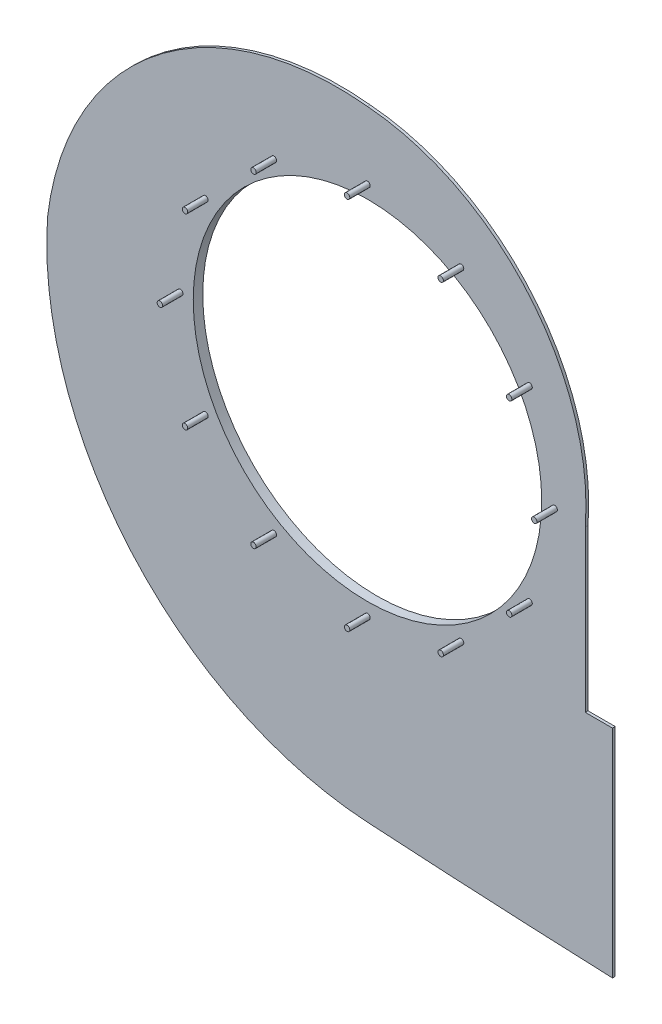
ISO-10303-21;
HEADER;
FILE_DESCRIPTION(('STEP AP214'),'2;1');
FILE_NAME('part.step','',(''),(''),'','','');
FILE_SCHEMA(('AUTOMOTIVE_DESIGN { 1 0 10303 214 1 1 1 1 }'));
ENDSEC;
DATA;
#1=APPLICATION_CONTEXT('core data for automotive mechanical design processes');
#2=APPLICATION_PROTOCOL_DEFINITION('international standard','automotive_design',2000,#1);
#3=PRODUCT_CONTEXT('',#1,'mechanical');
#4=PRODUCT('Part','Part','',(#3));
#5=PRODUCT_RELATED_PRODUCT_CATEGORY('part','',(#4));
#6=PRODUCT_DEFINITION_FORMATION('','',#4);
#7=PRODUCT_DEFINITION_CONTEXT('part definition',#1,'design');
#8=PRODUCT_DEFINITION('design','',#6,#7);
#9=PRODUCT_DEFINITION_SHAPE('','',#8);
#10=(LENGTH_UNIT() NAMED_UNIT(*) SI_UNIT(.MILLI.,.METRE.));
#11=(NAMED_UNIT(*) PLANE_ANGLE_UNIT() SI_UNIT($,.RADIAN.));
#12=(NAMED_UNIT(*) SI_UNIT($,.STERADIAN.) SOLID_ANGLE_UNIT());
#13=UNCERTAINTY_MEASURE_WITH_UNIT(LENGTH_MEASURE(1.E-05),#10,'distance_accuracy_value','');
#14=(GEOMETRIC_REPRESENTATION_CONTEXT(3) GLOBAL_UNCERTAINTY_ASSIGNED_CONTEXT((#13)) GLOBAL_UNIT_ASSIGNED_CONTEXT((#10,
#11,#12)) REPRESENTATION_CONTEXT('',''));
#15=CARTESIAN_POINT('',(0.,0.,0.));
#16=DIRECTION('',(0.,0.,1.));
#17=DIRECTION('',(1.,0.,0.));
#18=AXIS2_PLACEMENT_3D('',#15,#16,#17);
#19=CARTESIAN_POINT('',(576.066247787801,722.326123374747,0.));
#20=DIRECTION('',(0.,0.,-1.));
#21=DIRECTION('',(-1.,0.,0.));
#22=AXIS2_PLACEMENT_3D('',#19,#20,#21);
#23=PLANE('',#22);
#24=CARTESIAN_POINT('',(576.066247787801,722.326123374747,0.));
#25=DIRECTION('',(0.,0.,1.));
#26=DIRECTION('',(-1.,0.,0.));
#27=AXIS2_PLACEMENT_3D('',#24,#25,#26);
#28=CIRCLE('',#27,501.999999999996);
#29=CARTESIAN_POINT('',(75.2691276417093,757.057153497337,0.));
#30=VERTEX_POINT('',#29);
#31=CARTESIAN_POINT('',(545.269127641714,221.271697797341,0.));
#32=VERTEX_POINT('',#31);
#33=EDGE_CURVE('E133',#30,#32,#28,.T.);
#34=ORIENTED_EDGE('',*,*,#33,.F.);
#35=CARTESIAN_POINT('',(500.927222897748,705.599007443102,0.));
#36=DIRECTION('',(0.,0.,1.));
#37=DIRECTION('',(-1.,0.,0.));
#38=AXIS2_PLACEMENT_3D('',#35,#36,#37);
#39=CIRCLE('',#38,428.75722134133);
#40=CARTESIAN_POINT('',(545.269127641709,1132.05715349734,0.));
#41=VERTEX_POINT('',#40);
#42=EDGE_CURVE('E90',#41,#30,#39,.T.);
#43=ORIENTED_EDGE('',*,*,#42,.F.);
#44=CARTESIAN_POINT('',(517.354671903609,784.203484600825,0.));
#45=DIRECTION('',(0.,0.,1.));
#46=DIRECTION('',(-1.,0.,0.));
#47=AXIS2_PLACEMENT_3D('',#44,#45,#46);
#48=CIRCLE('',#47,348.971906897846);
#49=CARTESIAN_POINT('',(865.269127641709,757.057153497337,0.));
#50=VERTEX_POINT('',#49);
#51=EDGE_CURVE('E84',#50,#41,#48,.T.);
#52=ORIENTED_EDGE('',*,*,#51,.F.);
#53=DIRECTION('',(0.,1.,0.));
#54=VECTOR('',#53,1.);
#55=CARTESIAN_POINT('',(865.269127641709,521.057153497337,0.));
#56=LINE('',#55,#54);
#57=CARTESIAN_POINT('',(865.269127641709,521.057153497337,0.));
#58=VERTEX_POINT('',#57);
#59=EDGE_CURVE('E123',#58,#50,#56,.T.);
#60=ORIENTED_EDGE('',*,*,#59,.F.);
#61=DIRECTION('',(-1.,0.,0.));
#62=VECTOR('',#61,1.);
#63=CARTESIAN_POINT('',(865.269127641709,521.057153497337,0.));
#64=LINE('',#63,#62);
#65=CARTESIAN_POINT('',(905.269127641709,521.057153497337,0.));
#66=VERTEX_POINT('',#65);
#67=EDGE_CURVE('E141',#66,#58,#64,.T.);
#68=ORIENTED_EDGE('',*,*,#67,.F.);
#69=DIRECTION('',(0.,1.,0.));
#70=VECTOR('',#69,1.);
#71=CARTESIAN_POINT('',(905.269127641709,521.057153497337,0.));
#72=LINE('',#71,#70);
#73=CARTESIAN_POINT('',(905.269127641709,203.057153497337,0.));
#74=VERTEX_POINT('',#73);
#75=EDGE_CURVE('E139',#74,#66,#72,.T.);
#76=ORIENTED_EDGE('',*,*,#75,.F.);
#77=CARTESIAN_POINT('',(1565.81350018343,16825.0408792696,0.));
#78=DIRECTION('',(0.,0.,1.));
#79=DIRECTION('',(1.,0.,0.));
#80=AXIS2_PLACEMENT_3D('',#77,#78,#79);
#81=CIRCLE('',#80,16635.1033013906);
#82=EDGE_CURVE('E136',#32,#74,#81,.T.);
#83=ORIENTED_EDGE('',*,*,#82,.F.);
#84=EDGE_LOOP('',(#34,#43,#52,#60,#68,#76,#83));
#85=FACE_BOUND('',#84,.T.);
#86=CARTESIAN_POINT('',(545.269127641709,758.057153497338,0.));
#87=DIRECTION('',(0.,0.,-1.));
#88=DIRECTION('',(-1.,0.,0.));
#89=AXIS2_PLACEMENT_3D('',#86,#87,#88);
#90=CIRCLE('',#89,258.);
#91=CARTESIAN_POINT('',(287.269127641709,758.057153497338,0.));
#92=VERTEX_POINT('',#91);
#93=EDGE_CURVE('E224',#92,#92,#90,.T.);
#94=ORIENTED_EDGE('',*,*,#93,.F.);
#95=EDGE_LOOP('',(#94));
#96=FACE_BOUND('',#95,.T.);
#97=ADVANCED_FACE('F41',(#85,#96),#23,.T.);
#98=CARTESIAN_POINT('',(576.066247787801,722.326123374747,4.));
#99=DIRECTION('',(0.,0.,-1.));
#100=DIRECTION('',(-1.,0.,0.));
#101=AXIS2_PLACEMENT_3D('',#98,#99,#100);
#102=CYLINDRICAL_SURFACE('',#101,501.999999999996);
#103=ORIENTED_EDGE('',*,*,#33,.T.);
#104=DIRECTION('',(0.,0.,-1.));
#105=VECTOR('',#104,1.);
#106=CARTESIAN_POINT('',(545.269127641714,221.271697797341,4.));
#107=LINE('',#106,#105);
#108=CARTESIAN_POINT('',(545.269127641714,221.271697797341,4.));
#109=VERTEX_POINT('',#108);
#110=EDGE_CURVE('E156',#109,#32,#107,.T.);
#111=ORIENTED_EDGE('',*,*,#110,.F.);
#112=CARTESIAN_POINT('',(576.066247787801,722.326123374747,4.));
#113=DIRECTION('',(0.,0.,1.));
#114=DIRECTION('',(-1.,0.,0.));
#115=AXIS2_PLACEMENT_3D('',#112,#113,#114);
#116=CIRCLE('',#115,501.999999999996);
#117=CARTESIAN_POINT('',(75.2691276417093,757.057153497337,4.));
#118=VERTEX_POINT('',#117);
#119=EDGE_CURVE('E146',#118,#109,#116,.T.);
#120=ORIENTED_EDGE('',*,*,#119,.F.);
#121=DIRECTION('',(0.,0.,-1.));
#122=VECTOR('',#121,1.);
#123=CARTESIAN_POINT('',(75.2691276417093,757.057153497337,4.));
#124=LINE('',#123,#122);
#125=EDGE_CURVE('E129',#118,#30,#124,.T.);
#126=ORIENTED_EDGE('',*,*,#125,.T.);
#127=EDGE_LOOP('',(#103,#111,#120,#126));
#128=FACE_BOUND('',#127,.T.);
#129=ADVANCED_FACE('F43',(#128),#102,.T.);
#130=CARTESIAN_POINT('',(1565.81350018343,16825.0408792696,4.));
#131=DIRECTION('',(0.,0.,-1.));
#132=DIRECTION('',(-1.,0.,0.));
#133=AXIS2_PLACEMENT_3D('',#130,#131,#132);
#134=CYLINDRICAL_SURFACE('',#133,16635.1033013906);
#135=ORIENTED_EDGE('',*,*,#82,.T.);
#136=DIRECTION('',(0.,0.,-1.));
#137=VECTOR('',#136,1.);
#138=CARTESIAN_POINT('',(905.269127641709,203.057153497337,4.));
#139=LINE('',#138,#137);
#140=CARTESIAN_POINT('',(905.269127641709,203.057153497337,4.));
#141=VERTEX_POINT('',#140);
#142=EDGE_CURVE('E153',#141,#74,#139,.T.);
#143=ORIENTED_EDGE('',*,*,#142,.F.);
#144=CARTESIAN_POINT('',(1565.81350018343,16825.0408792696,4.));
#145=DIRECTION('',(0.,0.,1.));
#146=DIRECTION('',(1.,0.,0.));
#147=AXIS2_PLACEMENT_3D('',#144,#145,#146);
#148=CIRCLE('',#147,16635.1033013906);
#149=EDGE_CURVE('E99',#109,#141,#148,.T.);
#150=ORIENTED_EDGE('',*,*,#149,.F.);
#151=ORIENTED_EDGE('',*,*,#110,.T.);
#152=EDGE_LOOP('',(#135,#143,#150,#151));
#153=FACE_BOUND('',#152,.T.);
#154=ADVANCED_FACE('F256',(#153),#134,.T.);
#155=CARTESIAN_POINT('',(905.269127641709,521.057153497337,4.));
#156=DIRECTION('',(-1.,0.,0.));
#157=DIRECTION('',(0.,0.,1.));
#158=AXIS2_PLACEMENT_3D('',#155,#156,#157);
#159=PLANE('',#158);
#160=ORIENTED_EDGE('',*,*,#75,.T.);
#161=DIRECTION('',(0.,0.,-1.));
#162=VECTOR('',#161,1.);
#163=CARTESIAN_POINT('',(905.269127641709,521.057153497337,4.));
#164=LINE('',#163,#162);
#165=CARTESIAN_POINT('',(905.269127641709,521.057153497337,4.));
#166=VERTEX_POINT('',#165);
#167=EDGE_CURVE('E150',#166,#66,#164,.T.);
#168=ORIENTED_EDGE('',*,*,#167,.F.);
#169=DIRECTION('',(0.,1.,0.));
#170=VECTOR('',#169,1.);
#171=CARTESIAN_POINT('',(905.269127641709,521.057153497337,4.));
#172=LINE('',#171,#170);
#173=EDGE_CURVE('E230',#141,#166,#172,.T.);
#174=ORIENTED_EDGE('',*,*,#173,.F.);
#175=ORIENTED_EDGE('',*,*,#142,.T.);
#176=EDGE_LOOP('',(#160,#168,#174,#175));
#177=FACE_BOUND('',#176,.T.);
#178=ADVANCED_FACE('F234',(#177),#159,.F.);
#179=CARTESIAN_POINT('',(865.269127641709,521.057153497337,4.));
#180=DIRECTION('',(0.,-1.,0.));
#181=DIRECTION('',(0.,0.,-1.));
#182=AXIS2_PLACEMENT_3D('',#179,#180,#181);
#183=PLANE('',#182);
#184=ORIENTED_EDGE('',*,*,#67,.T.);
#185=DIRECTION('',(0.,0.,-1.));
#186=VECTOR('',#185,1.);
#187=CARTESIAN_POINT('',(865.269127641709,521.057153497337,4.));
#188=LINE('',#187,#186);
#189=CARTESIAN_POINT('',(865.269127641709,521.057153497337,4.));
#190=VERTEX_POINT('',#189);
#191=EDGE_CURVE('E124',#190,#58,#188,.T.);
#192=ORIENTED_EDGE('',*,*,#191,.F.);
#193=DIRECTION('',(-1.,0.,0.));
#194=VECTOR('',#193,1.);
#195=CARTESIAN_POINT('',(865.269127641709,521.057153497337,4.));
#196=LINE('',#195,#194);
#197=EDGE_CURVE('E115',#166,#190,#196,.T.);
#198=ORIENTED_EDGE('',*,*,#197,.F.);
#199=ORIENTED_EDGE('',*,*,#167,.T.);
#200=EDGE_LOOP('',(#184,#192,#198,#199));
#201=FACE_BOUND('',#200,.T.);
#202=ADVANCED_FACE('F238',(#201),#183,.F.);
#203=CARTESIAN_POINT('',(865.269127641709,521.057153497337,4.));
#204=DIRECTION('',(-1.,0.,0.));
#205=DIRECTION('',(0.,0.,1.));
#206=AXIS2_PLACEMENT_3D('',#203,#204,#205);
#207=PLANE('',#206);
#208=ORIENTED_EDGE('',*,*,#59,.T.);
#209=DIRECTION('',(0.,0.,-1.));
#210=VECTOR('',#209,1.);
#211=CARTESIAN_POINT('',(865.269127641709,757.057153497337,4.));
#212=LINE('',#211,#210);
#213=CARTESIAN_POINT('',(865.269127641709,757.057153497337,4.));
#214=VERTEX_POINT('',#213);
#215=EDGE_CURVE('E120',#214,#50,#212,.T.);
#216=ORIENTED_EDGE('',*,*,#215,.F.);
#217=DIRECTION('',(0.,1.,0.));
#218=VECTOR('',#217,1.);
#219=CARTESIAN_POINT('',(865.269127641709,521.057153497337,4.));
#220=LINE('',#219,#218);
#221=EDGE_CURVE('E109',#190,#214,#220,.T.);
#222=ORIENTED_EDGE('',*,*,#221,.F.);
#223=ORIENTED_EDGE('',*,*,#191,.T.);
#224=EDGE_LOOP('',(#208,#216,#222,#223));
#225=FACE_BOUND('',#224,.T.);
#226=ADVANCED_FACE('F121',(#225),#207,.F.);
#227=CARTESIAN_POINT('',(517.354671903609,784.203484600825,4.));
#228=DIRECTION('',(0.,0.,-1.));
#229=DIRECTION('',(-1.,0.,0.));
#230=AXIS2_PLACEMENT_3D('',#227,#228,#229);
#231=CYLINDRICAL_SURFACE('',#230,348.971906897846);
#232=ORIENTED_EDGE('',*,*,#51,.T.);
#233=DIRECTION('',(0.,0.,-1.));
#234=VECTOR('',#233,1.);
#235=CARTESIAN_POINT('',(545.269127641709,1132.05715349734,4.));
#236=LINE('',#235,#234);
#237=CARTESIAN_POINT('',(545.269127641709,1132.05715349734,4.));
#238=VERTEX_POINT('',#237);
#239=EDGE_CURVE('E125',#238,#41,#236,.T.);
#240=ORIENTED_EDGE('',*,*,#239,.F.);
#241=CARTESIAN_POINT('',(517.354671903609,784.203484600825,4.));
#242=DIRECTION('',(0.,0.,1.));
#243=DIRECTION('',(-1.,0.,0.));
#244=AXIS2_PLACEMENT_3D('',#241,#242,#243);
#245=CIRCLE('',#244,348.971906897846);
#246=EDGE_CURVE('E113',#214,#238,#245,.T.);
#247=ORIENTED_EDGE('',*,*,#246,.F.);
#248=ORIENTED_EDGE('',*,*,#215,.T.);
#249=EDGE_LOOP('',(#232,#240,#247,#248));
#250=FACE_BOUND('',#249,.T.);
#251=ADVANCED_FACE('F127',(#250),#231,.T.);
#252=CARTESIAN_POINT('',(500.927222897748,705.599007443102,4.));
#253=DIRECTION('',(0.,0.,-1.));
#254=DIRECTION('',(-1.,0.,0.));
#255=AXIS2_PLACEMENT_3D('',#252,#253,#254);
#256=CYLINDRICAL_SURFACE('',#255,428.75722134133);
#257=ORIENTED_EDGE('',*,*,#42,.T.);
#258=ORIENTED_EDGE('',*,*,#125,.F.);
#259=CARTESIAN_POINT('',(500.927222897748,705.599007443102,4.));
#260=DIRECTION('',(0.,0.,1.));
#261=DIRECTION('',(-1.,0.,0.));
#262=AXIS2_PLACEMENT_3D('',#259,#260,#261);
#263=CIRCLE('',#262,428.75722134133);
#264=EDGE_CURVE('E58',#238,#118,#263,.T.);
#265=ORIENTED_EDGE('',*,*,#264,.F.);
#266=ORIENTED_EDGE('',*,*,#239,.T.);
#267=EDGE_LOOP('',(#257,#258,#265,#266));
#268=FACE_BOUND('',#267,.T.);
#269=ADVANCED_FACE('F195',(#268),#256,.T.);
#270=CARTESIAN_POINT('',(576.066247787801,722.326123374747,4.));
#271=DIRECTION('',(0.,0.,-1.));
#272=DIRECTION('',(-1.,0.,0.));
#273=AXIS2_PLACEMENT_3D('',#270,#271,#272);
#274=PLANE('',#273);
#275=CARTESIAN_POINT('',(682.769127641706,996.21413953806,4.));
#276=DIRECTION('',(0.,0.,-1.));
#277=DIRECTION('',(-1.,0.,0.));
#278=AXIS2_PLACEMENT_3D('',#275,#276,#277);
#279=CIRCLE('',#278,3.99999999999999);
#280=CARTESIAN_POINT('',(678.769127641706,996.21413953806,4.));
#281=VERTEX_POINT('',#280);
#282=EDGE_CURVE('E12',#281,#281,#279,.F.);
#283=ORIENTED_EDGE('',*,*,#282,.F.);
#284=EDGE_LOOP('',(#283));
#285=FACE_BOUND('',#284,.T.);
#286=CARTESIAN_POINT('',(783.426113682428,895.55715349734,4.));
#287=DIRECTION('',(0.,0.,-1.));
#288=DIRECTION('',(-1.,0.,0.));
#289=AXIS2_PLACEMENT_3D('',#286,#287,#288);
#290=CIRCLE('',#289,3.99999999999999);
#291=CARTESIAN_POINT('',(779.426113682428,895.55715349734,4.));
#292=VERTEX_POINT('',#291);
#293=EDGE_CURVE('E50',#292,#292,#290,.F.);
#294=ORIENTED_EDGE('',*,*,#293,.F.);
#295=EDGE_LOOP('',(#294));
#296=FACE_BOUND('',#295,.T.);
#297=CARTESIAN_POINT('',(820.269127641709,758.05715349734,4.));
#298=DIRECTION('',(0.,0.,-1.));
#299=DIRECTION('',(-1.,0.,0.));
#300=AXIS2_PLACEMENT_3D('',#297,#298,#299);
#301=CIRCLE('',#300,3.99999999999999);
#302=CARTESIAN_POINT('',(816.269127641709,758.05715349734,4.));
#303=VERTEX_POINT('',#302);
#304=EDGE_CURVE('E185',#303,#303,#301,.F.);
#305=ORIENTED_EDGE('',*,*,#304,.F.);
#306=EDGE_LOOP('',(#305));
#307=FACE_BOUND('',#306,.T.);
#308=CARTESIAN_POINT('',(783.426113682431,620.55715349734,4.));
#309=DIRECTION('',(0.,0.,-1.));
#310=DIRECTION('',(-1.,0.,0.));
#311=AXIS2_PLACEMENT_3D('',#308,#309,#310);
#312=CIRCLE('',#311,3.99999999999999);
#313=CARTESIAN_POINT('',(779.426113682431,620.55715349734,4.));
#314=VERTEX_POINT('',#313);
#315=EDGE_CURVE('E182',#314,#314,#312,.F.);
#316=ORIENTED_EDGE('',*,*,#315,.F.);
#317=EDGE_LOOP('',(#316));
#318=FACE_BOUND('',#317,.T.);
#319=CARTESIAN_POINT('',(682.769127641711,519.900167456618,4.));
#320=DIRECTION('',(0.,0.,-1.));
#321=DIRECTION('',(-1.,0.,0.));
#322=AXIS2_PLACEMENT_3D('',#319,#320,#321);
#323=CIRCLE('',#322,3.99999999999999);
#324=CARTESIAN_POINT('',(678.769127641711,519.900167456618,4.));
#325=VERTEX_POINT('',#324);
#326=EDGE_CURVE('E179',#325,#325,#323,.F.);
#327=ORIENTED_EDGE('',*,*,#326,.F.);
#328=EDGE_LOOP('',(#327));
#329=FACE_BOUND('',#328,.T.);
#330=CARTESIAN_POINT('',(545.269127641709,483.057153497338,4.));
#331=DIRECTION('',(0.,0.,-1.));
#332=DIRECTION('',(-1.,0.,0.));
#333=AXIS2_PLACEMENT_3D('',#330,#331,#332);
#334=CIRCLE('',#333,3.99999999999999);
#335=CARTESIAN_POINT('',(541.269127641709,483.057153497338,4.));
#336=VERTEX_POINT('',#335);
#337=EDGE_CURVE('E176',#336,#336,#334,.F.);
#338=ORIENTED_EDGE('',*,*,#337,.F.);
#339=EDGE_LOOP('',(#338));
#340=FACE_BOUND('',#339,.T.);
#341=CARTESIAN_POINT('',(407.769127641711,519.900167456616,4.));
#342=DIRECTION('',(0.,0.,-1.));
#343=DIRECTION('',(-1.,0.,0.));
#344=AXIS2_PLACEMENT_3D('',#341,#342,#343);
#345=CIRCLE('',#344,3.99999999999999);
#346=CARTESIAN_POINT('',(403.769127641711,519.900167456616,4.));
#347=VERTEX_POINT('',#346);
#348=EDGE_CURVE('E173',#347,#347,#345,.F.);
#349=ORIENTED_EDGE('',*,*,#348,.F.);
#350=EDGE_LOOP('',(#349));
#351=FACE_BOUND('',#350,.T.);
#352=CARTESIAN_POINT('',(307.112141600989,620.557153497336,4.));
#353=DIRECTION('',(0.,0.,-1.));
#354=DIRECTION('',(-1.,0.,0.));
#355=AXIS2_PLACEMENT_3D('',#352,#353,#354);
#356=CIRCLE('',#355,3.99999999999999);
#357=CARTESIAN_POINT('',(303.112141600989,620.557153497336,4.));
#358=VERTEX_POINT('',#357);
#359=EDGE_CURVE('E170',#358,#358,#356,.F.);
#360=ORIENTED_EDGE('',*,*,#359,.F.);
#361=EDGE_LOOP('',(#360));
#362=FACE_BOUND('',#361,.T.);
#363=CARTESIAN_POINT('',(270.269127641709,758.057153497337,4.));
#364=DIRECTION('',(0.,0.,-1.));
#365=DIRECTION('',(-1.,0.,0.));
#366=AXIS2_PLACEMENT_3D('',#363,#364,#365);
#367=CIRCLE('',#366,3.99999999999999);
#368=CARTESIAN_POINT('',(266.269127641709,758.057153497337,4.));
#369=VERTEX_POINT('',#368);
#370=EDGE_CURVE('E167',#369,#369,#367,.F.);
#371=ORIENTED_EDGE('',*,*,#370,.F.);
#372=EDGE_LOOP('',(#371));
#373=FACE_BOUND('',#372,.T.);
#374=CARTESIAN_POINT('',(307.112141600988,895.557153497337,4.));
#375=DIRECTION('',(0.,0.,-1.));
#376=DIRECTION('',(-1.,0.,0.));
#377=AXIS2_PLACEMENT_3D('',#374,#375,#376);
#378=CIRCLE('',#377,3.99999999999999);
#379=CARTESIAN_POINT('',(303.112141600988,895.557153497337,4.));
#380=VERTEX_POINT('',#379);
#381=EDGE_CURVE('E164',#380,#380,#378,.F.);
#382=ORIENTED_EDGE('',*,*,#381,.F.);
#383=EDGE_LOOP('',(#382));
#384=FACE_BOUND('',#383,.T.);
#385=CARTESIAN_POINT('',(407.769127641709,996.214139538058,4.));
#386=DIRECTION('',(0.,0.,-1.));
#387=DIRECTION('',(-1.,0.,0.));
#388=AXIS2_PLACEMENT_3D('',#385,#386,#387);
#389=CIRCLE('',#388,3.99999999999999);
#390=CARTESIAN_POINT('',(403.769127641709,996.214139538058,4.));
#391=VERTEX_POINT('',#390);
#392=EDGE_CURVE('E161',#391,#391,#389,.F.);
#393=ORIENTED_EDGE('',*,*,#392,.F.);
#394=EDGE_LOOP('',(#393));
#395=FACE_BOUND('',#394,.T.);
#396=CARTESIAN_POINT('',(545.269127641709,1033.05715349734,4.));
#397=DIRECTION('',(0.,0.,-1.));
#398=DIRECTION('',(-1.,0.,0.));
#399=AXIS2_PLACEMENT_3D('',#396,#397,#398);
#400=CIRCLE('',#399,3.99999999999999);
#401=CARTESIAN_POINT('',(541.269127641709,1033.05715349734,4.));
#402=VERTEX_POINT('',#401);
#403=EDGE_CURVE('E158',#402,#402,#400,.F.);
#404=ORIENTED_EDGE('',*,*,#403,.F.);
#405=EDGE_LOOP('',(#404));
#406=FACE_BOUND('',#405,.T.);
#407=CARTESIAN_POINT('',(545.269127641709,758.057153497338,4.));
#408=DIRECTION('',(0.,0.,1.));
#409=DIRECTION('',(1.,0.,0.));
#410=AXIS2_PLACEMENT_3D('',#407,#408,#409);
#411=CIRCLE('',#410,256.);
#412=CARTESIAN_POINT('',(801.269127641709,758.057153497338,4.));
#413=VERTEX_POINT('',#412);
#414=EDGE_CURVE('E137',#413,#413,#411,.T.);
#415=ORIENTED_EDGE('',*,*,#414,.F.);
#416=EDGE_LOOP('',(#415));
#417=FACE_BOUND('',#416,.T.);
#418=ORIENTED_EDGE('',*,*,#119,.T.);
#419=ORIENTED_EDGE('',*,*,#149,.T.);
#420=ORIENTED_EDGE('',*,*,#173,.T.);
#421=ORIENTED_EDGE('',*,*,#197,.T.);
#422=ORIENTED_EDGE('',*,*,#221,.T.);
#423=ORIENTED_EDGE('',*,*,#246,.T.);
#424=ORIENTED_EDGE('',*,*,#264,.T.);
#425=EDGE_LOOP('',(#418,#419,#420,#421,#422,#423,#424));
#426=FACE_BOUND('',#425,.T.);
#427=ADVANCED_FACE('F111',(#285,#296,#307,#318,#329,#340,#351,#362,#373,#384,#395,#406,#417,
#426),#274,.F.);
#428=CARTESIAN_POINT('',(545.269127641709,758.057153497338,0.));
#429=DIRECTION('',(0.,0.,1.));
#430=DIRECTION('',(1.,0.,0.));
#431=AXIS2_PLACEMENT_3D('',#428,#429,#430);
#432=CYLINDRICAL_SURFACE('',#431,256.);
#433=ORIENTED_EDGE('',*,*,#414,.T.);
#434=EDGE_LOOP('',(#433));
#435=FACE_BOUND('',#434,.T.);
#436=CARTESIAN_POINT('',(545.269127641709,758.057153497338,-10.));
#437=DIRECTION('',(0.,0.,-1.));
#438=DIRECTION('',(-1.,0.,0.));
#439=AXIS2_PLACEMENT_3D('',#436,#437,#438);
#440=CIRCLE('',#439,256.);
#441=CARTESIAN_POINT('',(289.269127641709,758.057153497338,-10.));
#442=VERTEX_POINT('',#441);
#443=EDGE_CURVE('E402',#442,#442,#440,.T.);
#444=ORIENTED_EDGE('',*,*,#443,.T.);
#445=EDGE_LOOP('',(#444));
#446=FACE_BOUND('',#445,.T.);
#447=ADVANCED_FACE('F194',(#435,#446),#432,.F.);
#448=CARTESIAN_POINT('',(545.269127641709,758.057153497338,-10.));
#449=DIRECTION('',(0.,0.,-1.));
#450=DIRECTION('',(-1.,0.,0.));
#451=AXIS2_PLACEMENT_3D('',#448,#449,#450);
#452=PLANE('',#451);
#453=CARTESIAN_POINT('',(545.269127641709,758.057153497338,-10.));
#454=DIRECTION('',(0.,0.,-1.));
#455=DIRECTION('',(-1.,0.,0.));
#456=AXIS2_PLACEMENT_3D('',#453,#454,#455);
#457=CIRCLE('',#456,258.);
#458=CARTESIAN_POINT('',(287.269127641709,758.057153497338,-10.));
#459=VERTEX_POINT('',#458);
#460=EDGE_CURVE('E221',#459,#459,#457,.T.);
#461=ORIENTED_EDGE('',*,*,#460,.T.);
#462=EDGE_LOOP('',(#461));
#463=FACE_BOUND('',#462,.T.);
#464=ORIENTED_EDGE('',*,*,#443,.F.);
#465=EDGE_LOOP('',(#464));
#466=FACE_BOUND('',#465,.T.);
#467=ADVANCED_FACE('F260',(#463,#466),#452,.T.);
#468=CARTESIAN_POINT('',(545.269127641709,758.057153497338,-10.));
#469=DIRECTION('',(0.,0.,1.));
#470=DIRECTION('',(1.,0.,0.));
#471=AXIS2_PLACEMENT_3D('',#468,#469,#470);
#472=CYLINDRICAL_SURFACE('',#471,258.);
#473=ORIENTED_EDGE('',*,*,#460,.F.);
#474=EDGE_LOOP('',(#473));
#475=FACE_BOUND('',#474,.T.);
#476=ORIENTED_EDGE('',*,*,#93,.T.);
#477=EDGE_LOOP('',(#476));
#478=FACE_BOUND('',#477,.T.);
#479=ADVANCED_FACE('F261',(#475,#478),#472,.T.);
#480=CARTESIAN_POINT('',(545.269127641709,1033.05715349734,34.));
#481=DIRECTION('',(0.,0.,-1.));
#482=DIRECTION('',(-1.,0.,0.));
#483=AXIS2_PLACEMENT_3D('',#480,#481,#482);
#484=CYLINDRICAL_SURFACE('',#483,3.99999999999999);
#485=CARTESIAN_POINT('',(545.269127641709,1033.05715349734,34.));
#486=DIRECTION('',(0.,0.,1.));
#487=DIRECTION('',(1.,0.,0.));
#488=AXIS2_PLACEMENT_3D('',#485,#486,#487);
#489=CIRCLE('',#488,3.99999999999999);
#490=CARTESIAN_POINT('',(549.269127641709,1033.05715349734,34.));
#491=VERTEX_POINT('',#490);
#492=EDGE_CURVE('E399',#491,#491,#489,.T.);
#493=ORIENTED_EDGE('',*,*,#492,.F.);
#494=EDGE_LOOP('',(#493));
#495=FACE_BOUND('',#494,.T.);
#496=ORIENTED_EDGE('',*,*,#403,.T.);
#497=EDGE_LOOP('',(#496));
#498=FACE_BOUND('',#497,.T.);
#499=ADVANCED_FACE('F264',(#495,#498),#484,.T.);
#500=CARTESIAN_POINT('',(545.269127641709,1033.05715349734,34.));
#501=DIRECTION('',(0.,0.,1.));
#502=DIRECTION('',(1.,0.,0.));
#503=AXIS2_PLACEMENT_3D('',#500,#501,#502);
#504=PLANE('',#503);
#505=ORIENTED_EDGE('',*,*,#492,.T.);
#506=EDGE_LOOP('',(#505));
#507=FACE_BOUND('',#506,.T.);
#508=ADVANCED_FACE('F271',(#507),#504,.T.);
#509=CARTESIAN_POINT('',(407.769127641709,996.214139538058,34.));
#510=DIRECTION('',(0.,0.,-1.));
#511=DIRECTION('',(-1.,0.,0.));
#512=AXIS2_PLACEMENT_3D('',#509,#510,#511);
#513=CYLINDRICAL_SURFACE('',#512,3.99999999999999);
#514=CARTESIAN_POINT('',(407.769127641709,996.214139538058,34.));
#515=DIRECTION('',(0.,0.,1.));
#516=DIRECTION('',(0.866025403784438,0.500000000000001,0.));
#517=AXIS2_PLACEMENT_3D('',#514,#515,#516);
#518=CIRCLE('',#517,3.99999999999999);
#519=CARTESIAN_POINT('',(411.233229256847,998.214139538058,34.));
#520=VERTEX_POINT('',#519);
#521=EDGE_CURVE('E396',#520,#520,#518,.T.);
#522=ORIENTED_EDGE('',*,*,#521,.F.);
#523=EDGE_LOOP('',(#522));
#524=FACE_BOUND('',#523,.T.);
#525=ORIENTED_EDGE('',*,*,#392,.T.);
#526=EDGE_LOOP('',(#525));
#527=FACE_BOUND('',#526,.T.);
#528=ADVANCED_FACE('F275',(#524,#527),#513,.T.);
#529=CARTESIAN_POINT('',(407.769127641709,996.214139538058,34.));
#530=DIRECTION('',(0.,0.,1.));
#531=DIRECTION('',(0.866025403784438,0.500000000000001,0.));
#532=AXIS2_PLACEMENT_3D('',#529,#530,#531);
#533=PLANE('',#532);
#534=ORIENTED_EDGE('',*,*,#521,.T.);
#535=EDGE_LOOP('',(#534));
#536=FACE_BOUND('',#535,.T.);
#537=ADVANCED_FACE('F279',(#536),#533,.T.);
#538=CARTESIAN_POINT('',(307.112141600988,895.557153497337,34.));
#539=DIRECTION('',(0.,0.,-1.));
#540=DIRECTION('',(-1.,0.,0.));
#541=AXIS2_PLACEMENT_3D('',#538,#539,#540);
#542=CYLINDRICAL_SURFACE('',#541,3.99999999999999);
#543=CARTESIAN_POINT('',(307.112141600988,895.557153497337,34.));
#544=DIRECTION('',(0.,0.,1.));
#545=DIRECTION('',(0.499999999999998,0.86602540378444,0.));
#546=AXIS2_PLACEMENT_3D('',#543,#544,#545);
#547=CIRCLE('',#546,3.99999999999999);
#548=CARTESIAN_POINT('',(309.112141600988,899.021255112475,34.));
#549=VERTEX_POINT('',#548);
#550=EDGE_CURVE('E393',#549,#549,#547,.T.);
#551=ORIENTED_EDGE('',*,*,#550,.F.);
#552=EDGE_LOOP('',(#551));
#553=FACE_BOUND('',#552,.T.);
#554=ORIENTED_EDGE('',*,*,#381,.T.);
#555=EDGE_LOOP('',(#554));
#556=FACE_BOUND('',#555,.T.);
#557=ADVANCED_FACE('F283',(#553,#556),#542,.T.);
#558=CARTESIAN_POINT('',(307.112141600988,895.557153497337,34.));
#559=DIRECTION('',(0.,0.,1.));
#560=DIRECTION('',(0.499999999999998,0.86602540378444,0.));
#561=AXIS2_PLACEMENT_3D('',#558,#559,#560);
#562=PLANE('',#561);
#563=ORIENTED_EDGE('',*,*,#550,.T.);
#564=EDGE_LOOP('',(#563));
#565=FACE_BOUND('',#564,.T.);
#566=ADVANCED_FACE('F287',(#565),#562,.T.);
#567=CARTESIAN_POINT('',(270.269127641709,758.057153497337,34.));
#568=DIRECTION('',(0.,0.,-1.));
#569=DIRECTION('',(-1.,0.,0.));
#570=AXIS2_PLACEMENT_3D('',#567,#568,#569);
#571=CYLINDRICAL_SURFACE('',#570,3.99999999999999);
#572=CARTESIAN_POINT('',(270.269127641709,758.057153497337,34.));
#573=DIRECTION('',(0.,0.,1.));
#574=DIRECTION('',(0.,1.,0.));
#575=AXIS2_PLACEMENT_3D('',#572,#573,#574);
#576=CIRCLE('',#575,3.99999999999999);
#577=CARTESIAN_POINT('',(270.269127641709,762.057153497337,34.));
#578=VERTEX_POINT('',#577);
#579=EDGE_CURVE('E390',#578,#578,#576,.T.);
#580=ORIENTED_EDGE('',*,*,#579,.F.);
#581=EDGE_LOOP('',(#580));
#582=FACE_BOUND('',#581,.T.);
#583=ORIENTED_EDGE('',*,*,#370,.T.);
#584=EDGE_LOOP('',(#583));
#585=FACE_BOUND('',#584,.T.);
#586=ADVANCED_FACE('F291',(#582,#585),#571,.T.);
#587=CARTESIAN_POINT('',(270.269127641709,758.057153497337,34.));
#588=DIRECTION('',(0.,0.,1.));
#589=DIRECTION('',(0.,1.,0.));
#590=AXIS2_PLACEMENT_3D('',#587,#588,#589);
#591=PLANE('',#590);
#592=ORIENTED_EDGE('',*,*,#579,.T.);
#593=EDGE_LOOP('',(#592));
#594=FACE_BOUND('',#593,.T.);
#595=ADVANCED_FACE('F295',(#594),#591,.T.);
#596=CARTESIAN_POINT('',(307.112141600989,620.557153497336,34.));
#597=DIRECTION('',(0.,0.,-1.));
#598=DIRECTION('',(-1.,0.,0.));
#599=AXIS2_PLACEMENT_3D('',#596,#597,#598);
#600=CYLINDRICAL_SURFACE('',#599,3.99999999999999);
#601=CARTESIAN_POINT('',(307.112141600989,620.557153497336,34.));
#602=DIRECTION('',(0.,0.,1.));
#603=DIRECTION('',(-0.500000000000004,0.866025403784436,0.));
#604=AXIS2_PLACEMENT_3D('',#601,#602,#603);
#605=CIRCLE('',#604,3.99999999999999);
#606=CARTESIAN_POINT('',(305.112141600989,624.021255112474,34.));
#607=VERTEX_POINT('',#606);
#608=EDGE_CURVE('E387',#607,#607,#605,.T.);
#609=ORIENTED_EDGE('',*,*,#608,.F.);
#610=EDGE_LOOP('',(#609));
#611=FACE_BOUND('',#610,.T.);
#612=ORIENTED_EDGE('',*,*,#359,.T.);
#613=EDGE_LOOP('',(#612));
#614=FACE_BOUND('',#613,.T.);
#615=ADVANCED_FACE('F299',(#611,#614),#600,.T.);
#616=CARTESIAN_POINT('',(307.112141600989,620.557153497336,34.));
#617=DIRECTION('',(0.,0.,1.));
#618=DIRECTION('',(-0.500000000000004,0.866025403784436,0.));
#619=AXIS2_PLACEMENT_3D('',#616,#617,#618);
#620=PLANE('',#619);
#621=ORIENTED_EDGE('',*,*,#608,.T.);
#622=EDGE_LOOP('',(#621));
#623=FACE_BOUND('',#622,.T.);
#624=ADVANCED_FACE('F303',(#623),#620,.T.);
#625=CARTESIAN_POINT('',(407.769127641711,519.900167456616,34.));
#626=DIRECTION('',(0.,0.,-1.));
#627=DIRECTION('',(-1.,0.,0.));
#628=AXIS2_PLACEMENT_3D('',#625,#626,#627);
#629=CYLINDRICAL_SURFACE('',#628,3.99999999999999);
#630=CARTESIAN_POINT('',(407.769127641711,519.900167456616,34.));
#631=DIRECTION('',(0.,0.,1.));
#632=DIRECTION('',(-0.866025403784442,0.499999999999995,0.));
#633=AXIS2_PLACEMENT_3D('',#630,#631,#632);
#634=CIRCLE('',#633,3.99999999999999);
#635=CARTESIAN_POINT('',(404.305026026573,521.900167456616,34.));
#636=VERTEX_POINT('',#635);
#637=EDGE_CURVE('E384',#636,#636,#634,.T.);
#638=ORIENTED_EDGE('',*,*,#637,.F.);
#639=EDGE_LOOP('',(#638));
#640=FACE_BOUND('',#639,.T.);
#641=ORIENTED_EDGE('',*,*,#348,.T.);
#642=EDGE_LOOP('',(#641));
#643=FACE_BOUND('',#642,.T.);
#644=ADVANCED_FACE('F307',(#640,#643),#629,.T.);
#645=CARTESIAN_POINT('',(407.769127641711,519.900167456616,34.));
#646=DIRECTION('',(0.,0.,1.));
#647=DIRECTION('',(-0.866025403784442,0.499999999999995,0.));
#648=AXIS2_PLACEMENT_3D('',#645,#646,#647);
#649=PLANE('',#648);
#650=ORIENTED_EDGE('',*,*,#637,.T.);
#651=EDGE_LOOP('',(#650));
#652=FACE_BOUND('',#651,.T.);
#653=ADVANCED_FACE('F311',(#652),#649,.T.);
#654=CARTESIAN_POINT('',(545.269127641709,483.057153497338,34.));
#655=DIRECTION('',(0.,0.,-1.));
#656=DIRECTION('',(-1.,0.,0.));
#657=AXIS2_PLACEMENT_3D('',#654,#655,#656);
#658=CYLINDRICAL_SURFACE('',#657,3.99999999999999);
#659=CARTESIAN_POINT('',(545.269127641709,483.057153497338,34.));
#660=DIRECTION('',(0.,0.,1.));
#661=DIRECTION('',(-1.,0.,0.));
#662=AXIS2_PLACEMENT_3D('',#659,#660,#661);
#663=CIRCLE('',#662,3.99999999999999);
#664=CARTESIAN_POINT('',(541.269127641709,483.057153497338,34.));
#665=VERTEX_POINT('',#664);
#666=EDGE_CURVE('E381',#665,#665,#663,.T.);
#667=ORIENTED_EDGE('',*,*,#666,.F.);
#668=EDGE_LOOP('',(#667));
#669=FACE_BOUND('',#668,.T.);
#670=ORIENTED_EDGE('',*,*,#337,.T.);
#671=EDGE_LOOP('',(#670));
#672=FACE_BOUND('',#671,.T.);
#673=ADVANCED_FACE('F315',(#669,#672),#658,.T.);
#674=CARTESIAN_POINT('',(545.269127641709,483.057153497338,34.));
#675=DIRECTION('',(0.,0.,1.));
#676=DIRECTION('',(-1.,0.,0.));
#677=AXIS2_PLACEMENT_3D('',#674,#675,#676);
#678=PLANE('',#677);
#679=ORIENTED_EDGE('',*,*,#666,.T.);
#680=EDGE_LOOP('',(#679));
#681=FACE_BOUND('',#680,.T.);
#682=ADVANCED_FACE('F319',(#681),#678,.T.);
#683=CARTESIAN_POINT('',(682.769127641711,519.900167456618,34.));
#684=DIRECTION('',(0.,0.,-1.));
#685=DIRECTION('',(-1.,0.,0.));
#686=AXIS2_PLACEMENT_3D('',#683,#684,#685);
#687=CYLINDRICAL_SURFACE('',#686,3.99999999999999);
#688=CARTESIAN_POINT('',(682.769127641711,519.900167456618,34.));
#689=DIRECTION('',(0.,0.,1.));
#690=DIRECTION('',(-0.866025403784435,-0.500000000000007,0.));
#691=AXIS2_PLACEMENT_3D('',#688,#689,#690);
#692=CIRCLE('',#691,3.99999999999999);
#693=CARTESIAN_POINT('',(679.305026026573,517.900167456618,34.));
#694=VERTEX_POINT('',#693);
#695=EDGE_CURVE('E378',#694,#694,#692,.T.);
#696=ORIENTED_EDGE('',*,*,#695,.F.);
#697=EDGE_LOOP('',(#696));
#698=FACE_BOUND('',#697,.T.);
#699=ORIENTED_EDGE('',*,*,#326,.T.);
#700=EDGE_LOOP('',(#699));
#701=FACE_BOUND('',#700,.T.);
#702=ADVANCED_FACE('F323',(#698,#701),#687,.T.);
#703=CARTESIAN_POINT('',(682.769127641711,519.900167456618,34.));
#704=DIRECTION('',(0.,0.,1.));
#705=DIRECTION('',(-0.866025403784435,-0.500000000000007,0.));
#706=AXIS2_PLACEMENT_3D('',#703,#704,#705);
#707=PLANE('',#706);
#708=ORIENTED_EDGE('',*,*,#695,.T.);
#709=EDGE_LOOP('',(#708));
#710=FACE_BOUND('',#709,.T.);
#711=ADVANCED_FACE('F327',(#710),#707,.T.);
#712=CARTESIAN_POINT('',(783.426113682431,620.55715349734,34.));
#713=DIRECTION('',(0.,0.,-1.));
#714=DIRECTION('',(-1.,0.,0.));
#715=AXIS2_PLACEMENT_3D('',#712,#713,#714);
#716=CYLINDRICAL_SURFACE('',#715,3.99999999999999);
#717=CARTESIAN_POINT('',(783.426113682431,620.55715349734,34.));
#718=DIRECTION('',(0.,0.,1.));
#719=DIRECTION('',(-0.499999999999992,-0.866025403784443,0.));
#720=AXIS2_PLACEMENT_3D('',#717,#718,#719);
#721=CIRCLE('',#720,3.99999999999999);
#722=CARTESIAN_POINT('',(781.426113682431,617.093051882202,34.));
#723=VERTEX_POINT('',#722);
#724=EDGE_CURVE('E375',#723,#723,#721,.T.);
#725=ORIENTED_EDGE('',*,*,#724,.F.);
#726=EDGE_LOOP('',(#725));
#727=FACE_BOUND('',#726,.T.);
#728=ORIENTED_EDGE('',*,*,#315,.T.);
#729=EDGE_LOOP('',(#728));
#730=FACE_BOUND('',#729,.T.);
#731=ADVANCED_FACE('F331',(#727,#730),#716,.T.);
#732=CARTESIAN_POINT('',(783.426113682431,620.55715349734,34.));
#733=DIRECTION('',(0.,0.,1.));
#734=DIRECTION('',(-0.499999999999992,-0.866025403784443,0.));
#735=AXIS2_PLACEMENT_3D('',#732,#733,#734);
#736=PLANE('',#735);
#737=ORIENTED_EDGE('',*,*,#724,.T.);
#738=EDGE_LOOP('',(#737));
#739=FACE_BOUND('',#738,.T.);
#740=ADVANCED_FACE('F335',(#739),#736,.T.);
#741=CARTESIAN_POINT('',(820.269127641709,758.05715349734,34.));
#742=DIRECTION('',(0.,0.,-1.));
#743=DIRECTION('',(-1.,0.,0.));
#744=AXIS2_PLACEMENT_3D('',#741,#742,#743);
#745=CYLINDRICAL_SURFACE('',#744,3.99999999999999);
#746=CARTESIAN_POINT('',(820.269127641709,758.05715349734,34.));
#747=DIRECTION('',(0.,0.,1.));
#748=DIRECTION('',(0.,-1.,0.));
#749=AXIS2_PLACEMENT_3D('',#746,#747,#748);
#750=CIRCLE('',#749,3.99999999999999);
#751=CARTESIAN_POINT('',(820.269127641709,754.05715349734,34.));
#752=VERTEX_POINT('',#751);
#753=EDGE_CURVE('E370',#752,#752,#750,.T.);
#754=ORIENTED_EDGE('',*,*,#753,.F.);
#755=EDGE_LOOP('',(#754));
#756=FACE_BOUND('',#755,.T.);
#757=ORIENTED_EDGE('',*,*,#304,.T.);
#758=EDGE_LOOP('',(#757));
#759=FACE_BOUND('',#758,.T.);
#760=ADVANCED_FACE('F339',(#756,#759),#745,.T.);
#761=CARTESIAN_POINT('',(820.269127641709,758.05715349734,34.));
#762=DIRECTION('',(0.,0.,1.));
#763=DIRECTION('',(0.,-1.,0.));
#764=AXIS2_PLACEMENT_3D('',#761,#762,#763);
#765=PLANE('',#764);
#766=ORIENTED_EDGE('',*,*,#753,.T.);
#767=EDGE_LOOP('',(#766));
#768=FACE_BOUND('',#767,.T.);
#769=ADVANCED_FACE('F343',(#768),#765,.T.);
#770=CARTESIAN_POINT('',(783.426113682428,895.55715349734,34.));
#771=DIRECTION('',(0.,0.,-1.));
#772=DIRECTION('',(-1.,0.,0.));
#773=AXIS2_PLACEMENT_3D('',#770,#771,#772);
#774=CYLINDRICAL_SURFACE('',#773,3.99999999999999);
#775=CARTESIAN_POINT('',(783.426113682428,895.55715349734,34.));
#776=DIRECTION('',(0.,0.,1.));
#777=DIRECTION('',(0.50000000000001,-0.866025403784433,0.));
#778=AXIS2_PLACEMENT_3D('',#775,#776,#777);
#779=CIRCLE('',#778,3.99999999999999);
#780=CARTESIAN_POINT('',(785.426113682428,892.093051882203,34.));
#781=VERTEX_POINT('',#780);
#782=EDGE_CURVE('E367',#781,#781,#779,.T.);
#783=ORIENTED_EDGE('',*,*,#782,.F.);
#784=EDGE_LOOP('',(#783));
#785=FACE_BOUND('',#784,.T.);
#786=ORIENTED_EDGE('',*,*,#293,.T.);
#787=EDGE_LOOP('',(#786));
#788=FACE_BOUND('',#787,.T.);
#789=ADVANCED_FACE('F190',(#785,#788),#774,.T.);
#790=CARTESIAN_POINT('',(783.426113682428,895.55715349734,34.));
#791=DIRECTION('',(0.,0.,1.));
#792=DIRECTION('',(0.50000000000001,-0.866025403784433,0.));
#793=AXIS2_PLACEMENT_3D('',#790,#791,#792);
#794=PLANE('',#793);
#795=ORIENTED_EDGE('',*,*,#782,.T.);
#796=EDGE_LOOP('',(#795));
#797=FACE_BOUND('',#796,.T.);
#798=ADVANCED_FACE('F350',(#797),#794,.T.);
#799=CARTESIAN_POINT('',(682.769127641706,996.21413953806,34.));
#800=DIRECTION('',(0.,0.,-1.));
#801=DIRECTION('',(-1.,0.,0.));
#802=AXIS2_PLACEMENT_3D('',#799,#800,#801);
#803=CYLINDRICAL_SURFACE('',#802,3.99999999999999);
#804=CARTESIAN_POINT('',(682.769127641706,996.21413953806,34.));
#805=DIRECTION('',(0.,0.,1.));
#806=DIRECTION('',(0.866025403784445,-0.499999999999989,0.));
#807=AXIS2_PLACEMENT_3D('',#804,#805,#806);
#808=CIRCLE('',#807,3.99999999999999);
#809=CARTESIAN_POINT('',(686.233229256844,994.21413953806,34.));
#810=VERTEX_POINT('',#809);
#811=EDGE_CURVE('E366',#810,#810,#808,.T.);
#812=ORIENTED_EDGE('',*,*,#811,.F.);
#813=EDGE_LOOP('',(#812));
#814=FACE_BOUND('',#813,.T.);
#815=ORIENTED_EDGE('',*,*,#282,.T.);
#816=EDGE_LOOP('',(#815));
#817=FACE_BOUND('',#816,.T.);
#818=ADVANCED_FACE('F354',(#814,#817),#803,.T.);
#819=CARTESIAN_POINT('',(682.769127641706,996.21413953806,34.));
#820=DIRECTION('',(0.,0.,1.));
#821=DIRECTION('',(0.866025403784445,-0.499999999999989,0.));
#822=AXIS2_PLACEMENT_3D('',#819,#820,#821);
#823=PLANE('',#822);
#824=ORIENTED_EDGE('',*,*,#811,.T.);
#825=EDGE_LOOP('',(#824));
#826=FACE_BOUND('',#825,.T.);
#827=ADVANCED_FACE('F358',(#826),#823,.T.);
#828=CLOSED_SHELL('',(#97,#129,#154,#178,#202,#226,#251,#269,#427,#447,#467,#479,#499,#508,#528,
#537,#557,#566,#586,#595,#615,#624,#644,#653,#673,#682,#702,#711,#731,#740,#760,#769,#789,#798,
#818,#827));
#829=MANIFOLD_SOLID_BREP('B2',#828);
#830=ADVANCED_BREP_SHAPE_REPRESENTATION('',(#18,#829),#14);
#831=SHAPE_DEFINITION_REPRESENTATION(#9,#830);
ENDSEC;
END-ISO-10303-21;
